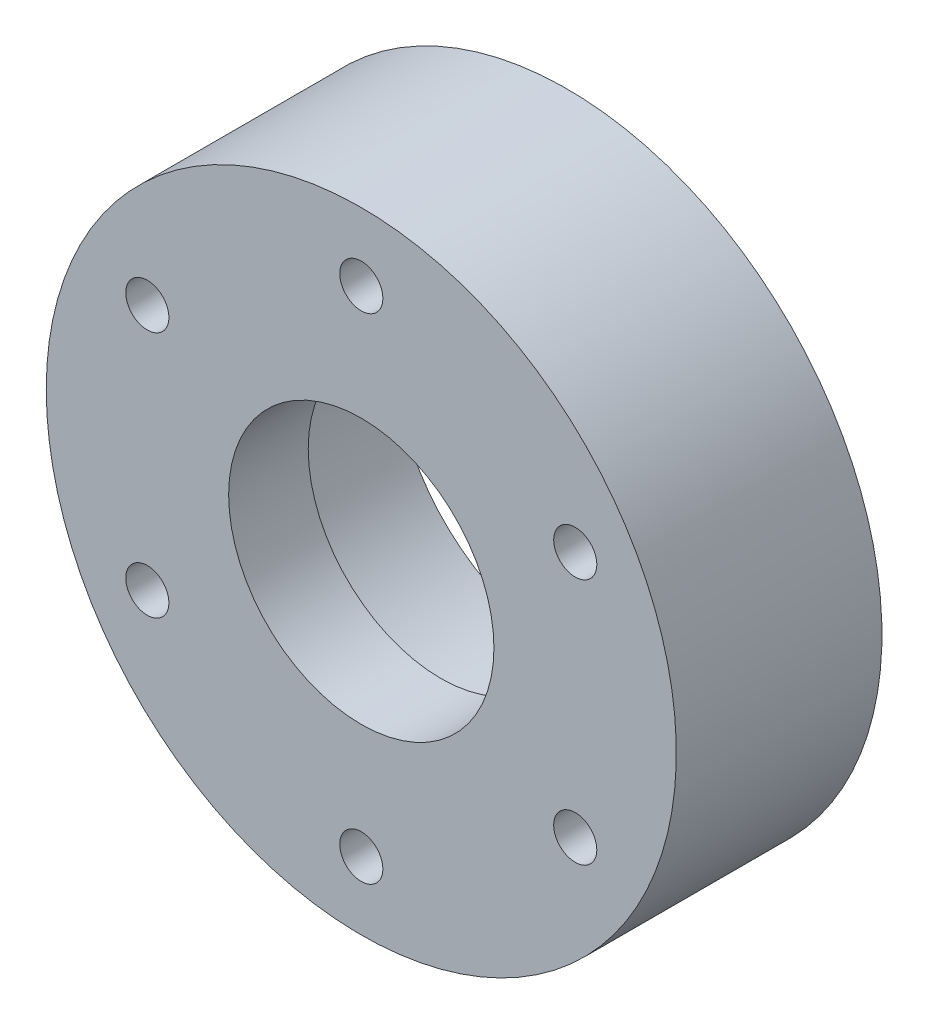
ISO-10303-21;
HEADER;
FILE_DESCRIPTION(('STEP AP214'),'2;1');
FILE_NAME('part.step','',(''),(''),'','','');
FILE_SCHEMA(('AUTOMOTIVE_DESIGN { 1 0 10303 214 1 1 1 1 }'));
ENDSEC;
DATA;
#1=APPLICATION_CONTEXT('core data for automotive mechanical design processes');
#2=APPLICATION_PROTOCOL_DEFINITION('international standard','automotive_design',2000,#1);
#3=PRODUCT_CONTEXT('',#1,'mechanical');
#4=PRODUCT('Part','Part','',(#3));
#5=PRODUCT_RELATED_PRODUCT_CATEGORY('part','',(#4));
#6=PRODUCT_DEFINITION_FORMATION('','',#4);
#7=PRODUCT_DEFINITION_CONTEXT('part definition',#1,'design');
#8=PRODUCT_DEFINITION('design','',#6,#7);
#9=PRODUCT_DEFINITION_SHAPE('','',#8);
#10=(LENGTH_UNIT() NAMED_UNIT(*) SI_UNIT(.MILLI.,.METRE.));
#11=(NAMED_UNIT(*) PLANE_ANGLE_UNIT() SI_UNIT($,.RADIAN.));
#12=(NAMED_UNIT(*) SI_UNIT($,.STERADIAN.) SOLID_ANGLE_UNIT());
#13=UNCERTAINTY_MEASURE_WITH_UNIT(LENGTH_MEASURE(1.E-05),#10,'distance_accuracy_value','');
#14=(GEOMETRIC_REPRESENTATION_CONTEXT(3) GLOBAL_UNCERTAINTY_ASSIGNED_CONTEXT((#13)) GLOBAL_UNIT_ASSIGNED_CONTEXT((#10,
#11,#12)) REPRESENTATION_CONTEXT('',''));
#15=CARTESIAN_POINT('',(0.,0.,0.));
#16=DIRECTION('',(0.,0.,1.));
#17=DIRECTION('',(1.,0.,0.));
#18=AXIS2_PLACEMENT_3D('',#15,#16,#17);
#19=CARTESIAN_POINT('',(0.,20.,31.));
#20=DIRECTION('',(0.,0.,1.));
#21=DIRECTION('',(1.,0.,0.));
#22=AXIS2_PLACEMENT_3D('',#19,#20,#21);
#23=PLANE('',#22);
#24=CARTESIAN_POINT('',(32.2594462909701,18.6250000000004,31.));
#25=DIRECTION('',(0.,0.,1.));
#26=DIRECTION('',(0.50000000000001,-0.866025403784433,0.));
#27=AXIS2_PLACEMENT_3D('',#24,#25,#26);
#28=CIRCLE('',#27,3.25);
#29=CARTESIAN_POINT('',(33.8844462909702,15.810417437701,31.));
#30=VERTEX_POINT('',#29);
#31=EDGE_CURVE('E69',#30,#30,#28,.T.);
#32=ORIENTED_EDGE('',*,*,#31,.F.);
#33=EDGE_LOOP('',(#32));
#34=FACE_BOUND('',#33,.T.);
#35=CARTESIAN_POINT('',(32.2594462909705,-18.6249999999997,31.));
#36=DIRECTION('',(0.,0.,1.));
#37=DIRECTION('',(-0.499999999999992,-0.866025403784443,0.));
#38=AXIS2_PLACEMENT_3D('',#35,#36,#37);
#39=CIRCLE('',#38,3.25);
#40=CARTESIAN_POINT('',(30.6344462909705,-21.4395825622992,31.));
#41=VERTEX_POINT('',#40);
#42=EDGE_CURVE('E75',#41,#41,#39,.T.);
#43=ORIENTED_EDGE('',*,*,#42,.F.);
#44=EDGE_LOOP('',(#43));
#45=FACE_BOUND('',#44,.T.);
#46=CARTESIAN_POINT('',(0.,-37.25,31.));
#47=DIRECTION('',(0.,0.,1.));
#48=DIRECTION('',(-1.,0.,0.));
#49=AXIS2_PLACEMENT_3D('',#46,#47,#48);
#50=CIRCLE('',#49,3.25);
#51=CARTESIAN_POINT('',(-3.25000000000001,-37.25,31.));
#52=VERTEX_POINT('',#51);
#53=EDGE_CURVE('E81',#52,#52,#50,.T.);
#54=ORIENTED_EDGE('',*,*,#53,.F.);
#55=EDGE_LOOP('',(#54));
#56=FACE_BOUND('',#55,.T.);
#57=CARTESIAN_POINT('',(-32.2594462909703,-18.6250000000001,31.));
#58=DIRECTION('',(0.,0.,1.));
#59=DIRECTION('',(-0.500000000000004,0.866025403784436,0.));
#60=AXIS2_PLACEMENT_3D('',#57,#58,#59);
#61=CIRCLE('',#60,3.25);
#62=CARTESIAN_POINT('',(-33.8844462909703,-15.8104174377007,31.));
#63=VERTEX_POINT('',#62);
#64=EDGE_CURVE('E87',#63,#63,#61,.T.);
#65=ORIENTED_EDGE('',*,*,#64,.F.);
#66=EDGE_LOOP('',(#65));
#67=FACE_BOUND('',#66,.T.);
#68=CARTESIAN_POINT('',(-32.2594462909704,18.6249999999999,31.));
#69=DIRECTION('',(0.,0.,1.));
#70=DIRECTION('',(0.499999999999998,0.86602540378444,0.));
#71=AXIS2_PLACEMENT_3D('',#68,#69,#70);
#72=CIRCLE('',#71,3.25);
#73=CARTESIAN_POINT('',(-30.6344462909704,21.4395825622994,31.));
#74=VERTEX_POINT('',#73);
#75=EDGE_CURVE('E63',#74,#74,#72,.T.);
#76=ORIENTED_EDGE('',*,*,#75,.F.);
#77=EDGE_LOOP('',(#76));
#78=FACE_BOUND('',#77,.T.);
#79=CARTESIAN_POINT('',(0.,37.25,31.));
#80=DIRECTION('',(0.,0.,1.));
#81=DIRECTION('',(1.,0.,0.));
#82=AXIS2_PLACEMENT_3D('',#79,#80,#81);
#83=CIRCLE('',#82,3.25);
#84=CARTESIAN_POINT('',(3.25000000000001,37.25,31.));
#85=VERTEX_POINT('',#84);
#86=EDGE_CURVE('E57',#85,#85,#83,.T.);
#87=ORIENTED_EDGE('',*,*,#86,.F.);
#88=EDGE_LOOP('',(#87));
#89=FACE_BOUND('',#88,.T.);
#90=CARTESIAN_POINT('',(0.,0.,31.));
#91=DIRECTION('',(0.,0.,-1.));
#92=DIRECTION('',(-1.,0.,0.));
#93=AXIS2_PLACEMENT_3D('',#90,#91,#92);
#94=CIRCLE('',#93,20.);
#95=CARTESIAN_POINT('',(-20.,0.,31.));
#96=VERTEX_POINT('',#95);
#97=EDGE_CURVE('E53',#96,#96,#94,.T.);
#98=ORIENTED_EDGE('',*,*,#97,.T.);
#99=EDGE_LOOP('',(#98));
#100=FACE_BOUND('',#99,.T.);
#101=CARTESIAN_POINT('',(0.,0.,31.));
#102=DIRECTION('',(0.,0.,-1.));
#103=DIRECTION('',(-1.,0.,0.));
#104=AXIS2_PLACEMENT_3D('',#101,#102,#103);
#105=CIRCLE('',#104,47.5);
#106=CARTESIAN_POINT('',(-47.5,0.,31.));
#107=VERTEX_POINT('',#106);
#108=EDGE_CURVE('E10',#107,#107,#105,.T.);
#109=ORIENTED_EDGE('',*,*,#108,.F.);
#110=EDGE_LOOP('',(#109));
#111=FACE_BOUND('',#110,.T.);
#112=ADVANCED_FACE('F31',(#34,#45,#56,#67,#78,#89,#100,#111),#23,.T.);
#113=CARTESIAN_POINT('',(0.,0.,0.));
#114=DIRECTION('',(0.,0.,-1.));
#115=DIRECTION('',(-1.,0.,0.));
#116=AXIS2_PLACEMENT_3D('',#113,#114,#115);
#117=CYLINDRICAL_SURFACE('',#116,47.5);
#118=ORIENTED_EDGE('',*,*,#108,.T.);
#119=EDGE_LOOP('',(#118));
#120=FACE_BOUND('',#119,.T.);
#121=CARTESIAN_POINT('',(0.,0.,0.));
#122=DIRECTION('',(0.,0.,-1.));
#123=DIRECTION('',(-1.,0.,0.));
#124=AXIS2_PLACEMENT_3D('',#121,#122,#123);
#125=CIRCLE('',#124,47.5);
#126=CARTESIAN_POINT('',(-47.5,0.,0.));
#127=VERTEX_POINT('',#126);
#128=EDGE_CURVE('E37',#127,#127,#125,.T.);
#129=ORIENTED_EDGE('',*,*,#128,.F.);
#130=EDGE_LOOP('',(#129));
#131=FACE_BOUND('',#130,.T.);
#132=ADVANCED_FACE('F106',(#120,#131),#117,.T.);
#133=CARTESIAN_POINT('',(0.,47.5,0.));
#134=DIRECTION('',(0.,0.,-1.));
#135=DIRECTION('',(-1.,0.,0.));
#136=AXIS2_PLACEMENT_3D('',#133,#134,#135);
#137=PLANE('',#136);
#138=CARTESIAN_POINT('',(32.2594462909701,18.6250000000004,0.));
#139=DIRECTION('',(0.,0.,1.));
#140=DIRECTION('',(0.50000000000001,-0.866025403784433,0.));
#141=AXIS2_PLACEMENT_3D('',#138,#139,#140);
#142=CIRCLE('',#141,3.25);
#143=CARTESIAN_POINT('',(33.8844462909702,15.810417437701,0.));
#144=VERTEX_POINT('',#143);
#145=EDGE_CURVE('E72',#144,#144,#142,.T.);
#146=ORIENTED_EDGE('',*,*,#145,.T.);
#147=EDGE_LOOP('',(#146));
#148=FACE_BOUND('',#147,.T.);
#149=CARTESIAN_POINT('',(32.2594462909705,-18.6249999999997,0.));
#150=DIRECTION('',(0.,0.,1.));
#151=DIRECTION('',(-0.499999999999992,-0.866025403784443,0.));
#152=AXIS2_PLACEMENT_3D('',#149,#150,#151);
#153=CIRCLE('',#152,3.25);
#154=CARTESIAN_POINT('',(30.6344462909705,-21.4395825622992,0.));
#155=VERTEX_POINT('',#154);
#156=EDGE_CURVE('E78',#155,#155,#153,.T.);
#157=ORIENTED_EDGE('',*,*,#156,.T.);
#158=EDGE_LOOP('',(#157));
#159=FACE_BOUND('',#158,.T.);
#160=CARTESIAN_POINT('',(0.,-37.25,0.));
#161=DIRECTION('',(0.,0.,1.));
#162=DIRECTION('',(-1.,0.,0.));
#163=AXIS2_PLACEMENT_3D('',#160,#161,#162);
#164=CIRCLE('',#163,3.25);
#165=CARTESIAN_POINT('',(-3.25000000000001,-37.25,0.));
#166=VERTEX_POINT('',#165);
#167=EDGE_CURVE('E84',#166,#166,#164,.T.);
#168=ORIENTED_EDGE('',*,*,#167,.T.);
#169=EDGE_LOOP('',(#168));
#170=FACE_BOUND('',#169,.T.);
#171=CARTESIAN_POINT('',(-32.2594462909703,-18.6250000000001,0.));
#172=DIRECTION('',(0.,0.,1.));
#173=DIRECTION('',(-0.500000000000004,0.866025403784436,0.));
#174=AXIS2_PLACEMENT_3D('',#171,#172,#173);
#175=CIRCLE('',#174,3.25);
#176=CARTESIAN_POINT('',(-33.8844462909703,-15.8104174377007,0.));
#177=VERTEX_POINT('',#176);
#178=EDGE_CURVE('E66',#177,#177,#175,.T.);
#179=ORIENTED_EDGE('',*,*,#178,.T.);
#180=EDGE_LOOP('',(#179));
#181=FACE_BOUND('',#180,.T.);
#182=CARTESIAN_POINT('',(-32.2594462909704,18.6249999999999,0.));
#183=DIRECTION('',(0.,0.,1.));
#184=DIRECTION('',(0.499999999999998,0.86602540378444,0.));
#185=AXIS2_PLACEMENT_3D('',#182,#183,#184);
#186=CIRCLE('',#185,3.25);
#187=CARTESIAN_POINT('',(-30.6344462909704,21.4395825622994,0.));
#188=VERTEX_POINT('',#187);
#189=EDGE_CURVE('E60',#188,#188,#186,.T.);
#190=ORIENTED_EDGE('',*,*,#189,.T.);
#191=EDGE_LOOP('',(#190));
#192=FACE_BOUND('',#191,.T.);
#193=CARTESIAN_POINT('',(0.,37.25,0.));
#194=DIRECTION('',(0.,0.,1.));
#195=DIRECTION('',(1.,0.,0.));
#196=AXIS2_PLACEMENT_3D('',#193,#194,#195);
#197=CIRCLE('',#196,3.25);
#198=CARTESIAN_POINT('',(3.25000000000001,37.25,0.));
#199=VERTEX_POINT('',#198);
#200=EDGE_CURVE('E56',#199,#199,#197,.T.);
#201=ORIENTED_EDGE('',*,*,#200,.T.);
#202=EDGE_LOOP('',(#201));
#203=FACE_BOUND('',#202,.T.);
#204=ORIENTED_EDGE('',*,*,#128,.T.);
#205=EDGE_LOOP('',(#204));
#206=FACE_BOUND('',#205,.T.);
#207=CARTESIAN_POINT('',(0.,0.,0.));
#208=DIRECTION('',(0.,0.,-1.));
#209=DIRECTION('',(-1.,0.,0.));
#210=AXIS2_PLACEMENT_3D('',#207,#208,#209);
#211=CIRCLE('',#210,26.);
#212=CARTESIAN_POINT('',(-26.,0.,0.));
#213=VERTEX_POINT('',#212);
#214=EDGE_CURVE('E41',#213,#213,#211,.T.);
#215=ORIENTED_EDGE('',*,*,#214,.F.);
#216=EDGE_LOOP('',(#215));
#217=FACE_BOUND('',#216,.T.);
#218=ADVANCED_FACE('F93',(#148,#159,#170,#181,#192,#203,#206,#217),#137,.T.);
#219=CARTESIAN_POINT('',(0.,0.,0.));
#220=DIRECTION('',(0.,0.,-1.));
#221=DIRECTION('',(-1.,0.,0.));
#222=AXIS2_PLACEMENT_3D('',#219,#220,#221);
#223=CYLINDRICAL_SURFACE('',#222,26.);
#224=ORIENTED_EDGE('',*,*,#214,.T.);
#225=EDGE_LOOP('',(#224));
#226=FACE_BOUND('',#225,.T.);
#227=CARTESIAN_POINT('',(0.,0.,19.));
#228=DIRECTION('',(0.,0.,-1.));
#229=DIRECTION('',(-1.,0.,0.));
#230=AXIS2_PLACEMENT_3D('',#227,#228,#229);
#231=CIRCLE('',#230,26.);
#232=CARTESIAN_POINT('',(-26.,0.,19.));
#233=VERTEX_POINT('',#232);
#234=EDGE_CURVE('E45',#233,#233,#231,.T.);
#235=ORIENTED_EDGE('',*,*,#234,.F.);
#236=EDGE_LOOP('',(#235));
#237=FACE_BOUND('',#236,.T.);
#238=ADVANCED_FACE('F127',(#226,#237),#223,.F.);
#239=CARTESIAN_POINT('',(0.,26.,19.));
#240=DIRECTION('',(0.,0.,-1.));
#241=DIRECTION('',(-1.,0.,0.));
#242=AXIS2_PLACEMENT_3D('',#239,#240,#241);
#243=PLANE('',#242);
#244=ORIENTED_EDGE('',*,*,#234,.T.);
#245=EDGE_LOOP('',(#244));
#246=FACE_BOUND('',#245,.T.);
#247=CARTESIAN_POINT('',(0.,0.,19.));
#248=DIRECTION('',(0.,0.,-1.));
#249=DIRECTION('',(-1.,0.,0.));
#250=AXIS2_PLACEMENT_3D('',#247,#248,#249);
#251=CIRCLE('',#250,20.);
#252=CARTESIAN_POINT('',(-20.,0.,19.));
#253=VERTEX_POINT('',#252);
#254=EDGE_CURVE('E50',#253,#253,#251,.T.);
#255=ORIENTED_EDGE('',*,*,#254,.F.);
#256=EDGE_LOOP('',(#255));
#257=FACE_BOUND('',#256,.T.);
#258=ADVANCED_FACE('F118',(#246,#257),#243,.T.);
#259=CARTESIAN_POINT('',(0.,0.,0.));
#260=DIRECTION('',(0.,0.,-1.));
#261=DIRECTION('',(-1.,0.,0.));
#262=AXIS2_PLACEMENT_3D('',#259,#260,#261);
#263=CYLINDRICAL_SURFACE('',#262,20.);
#264=ORIENTED_EDGE('',*,*,#254,.T.);
#265=EDGE_LOOP('',(#264));
#266=FACE_BOUND('',#265,.T.);
#267=ORIENTED_EDGE('',*,*,#97,.F.);
#268=EDGE_LOOP('',(#267));
#269=FACE_BOUND('',#268,.T.);
#270=ADVANCED_FACE('F115',(#266,#269),#263,.F.);
#271=CARTESIAN_POINT('',(0.,37.25,0.));
#272=DIRECTION('',(0.,0.,1.));
#273=DIRECTION('',(1.,0.,0.));
#274=AXIS2_PLACEMENT_3D('',#271,#272,#273);
#275=CYLINDRICAL_SURFACE('',#274,3.25);
#276=ORIENTED_EDGE('',*,*,#200,.F.);
#277=EDGE_LOOP('',(#276));
#278=FACE_BOUND('',#277,.T.);
#279=ORIENTED_EDGE('',*,*,#86,.T.);
#280=EDGE_LOOP('',(#279));
#281=FACE_BOUND('',#280,.T.);
#282=ADVANCED_FACE('F117',(#278,#281),#275,.F.);
#283=CARTESIAN_POINT('',(-32.2594462909704,18.6249999999999,0.));
#284=DIRECTION('',(0.,0.,1.));
#285=DIRECTION('',(1.,0.,0.));
#286=AXIS2_PLACEMENT_3D('',#283,#284,#285);
#287=CYLINDRICAL_SURFACE('',#286,3.25);
#288=ORIENTED_EDGE('',*,*,#189,.F.);
#289=EDGE_LOOP('',(#288));
#290=FACE_BOUND('',#289,.T.);
#291=ORIENTED_EDGE('',*,*,#75,.T.);
#292=EDGE_LOOP('',(#291));
#293=FACE_BOUND('',#292,.T.);
#294=ADVANCED_FACE('F100',(#290,#293),#287,.F.);
#295=CARTESIAN_POINT('',(-32.2594462909703,-18.6250000000001,0.));
#296=DIRECTION('',(0.,0.,1.));
#297=DIRECTION('',(1.,0.,0.));
#298=AXIS2_PLACEMENT_3D('',#295,#296,#297);
#299=CYLINDRICAL_SURFACE('',#298,3.25);
#300=ORIENTED_EDGE('',*,*,#178,.F.);
#301=EDGE_LOOP('',(#300));
#302=FACE_BOUND('',#301,.T.);
#303=ORIENTED_EDGE('',*,*,#64,.T.);
#304=EDGE_LOOP('',(#303));
#305=FACE_BOUND('',#304,.T.);
#306=ADVANCED_FACE('F96',(#302,#305),#299,.F.);
#307=CARTESIAN_POINT('',(0.,-37.25,0.));
#308=DIRECTION('',(0.,0.,1.));
#309=DIRECTION('',(1.,0.,0.));
#310=AXIS2_PLACEMENT_3D('',#307,#308,#309);
#311=CYLINDRICAL_SURFACE('',#310,3.25);
#312=ORIENTED_EDGE('',*,*,#167,.F.);
#313=EDGE_LOOP('',(#312));
#314=FACE_BOUND('',#313,.T.);
#315=ORIENTED_EDGE('',*,*,#53,.T.);
#316=EDGE_LOOP('',(#315));
#317=FACE_BOUND('',#316,.T.);
#318=ADVANCED_FACE('F99',(#314,#317),#311,.F.);
#319=CARTESIAN_POINT('',(32.2594462909705,-18.6249999999997,0.));
#320=DIRECTION('',(0.,0.,1.));
#321=DIRECTION('',(1.,0.,0.));
#322=AXIS2_PLACEMENT_3D('',#319,#320,#321);
#323=CYLINDRICAL_SURFACE('',#322,3.25);
#324=ORIENTED_EDGE('',*,*,#156,.F.);
#325=EDGE_LOOP('',(#324));
#326=FACE_BOUND('',#325,.T.);
#327=ORIENTED_EDGE('',*,*,#42,.T.);
#328=EDGE_LOOP('',(#327));
#329=FACE_BOUND('',#328,.T.);
#330=ADVANCED_FACE('F187',(#326,#329),#323,.F.);
#331=CARTESIAN_POINT('',(32.2594462909701,18.6250000000004,0.));
#332=DIRECTION('',(0.,0.,1.));
#333=DIRECTION('',(1.,0.,0.));
#334=AXIS2_PLACEMENT_3D('',#331,#332,#333);
#335=CYLINDRICAL_SURFACE('',#334,3.25);
#336=ORIENTED_EDGE('',*,*,#145,.F.);
#337=EDGE_LOOP('',(#336));
#338=FACE_BOUND('',#337,.T.);
#339=ORIENTED_EDGE('',*,*,#31,.T.);
#340=EDGE_LOOP('',(#339));
#341=FACE_BOUND('',#340,.T.);
#342=ADVANCED_FACE('F195',(#338,#341),#335,.F.);
#343=CLOSED_SHELL('',(#112,#132,#218,#238,#258,#270,#282,#294,#306,#318,#330,#342));
#344=MANIFOLD_SOLID_BREP('B2',#343);
#345=ADVANCED_BREP_SHAPE_REPRESENTATION('',(#18,#344),#14);
#346=SHAPE_DEFINITION_REPRESENTATION(#9,#345);
ENDSEC;
END-ISO-10303-21;
